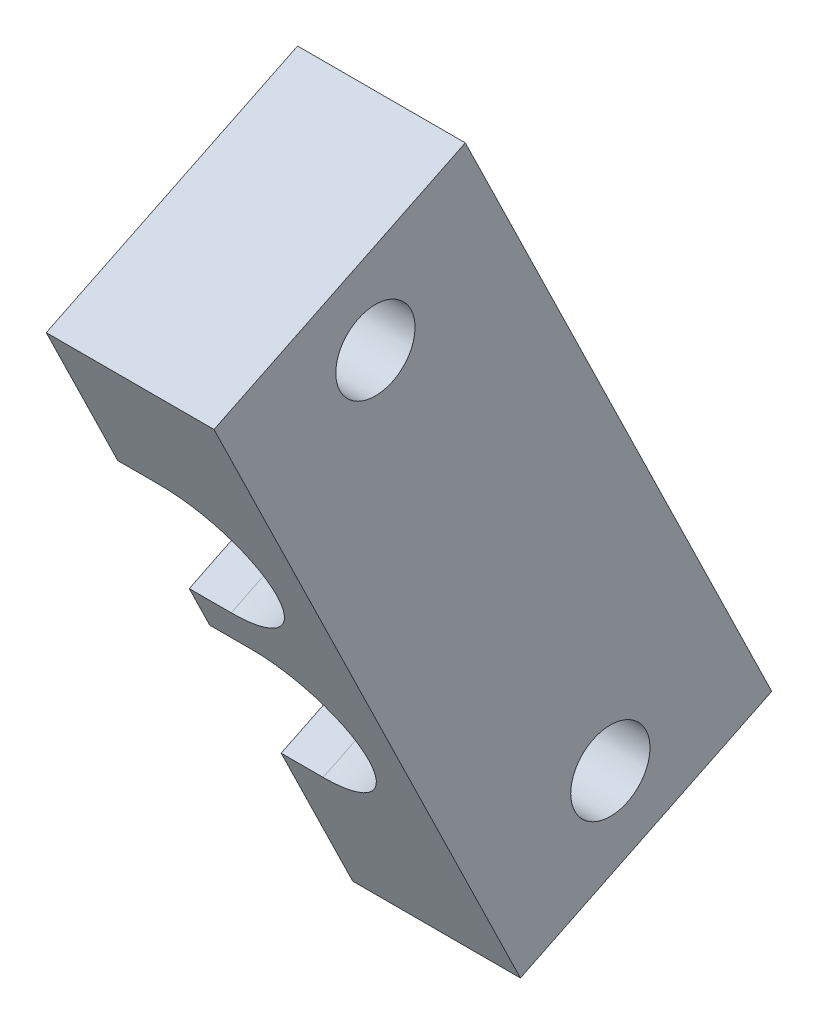
ISO-10303-21;
HEADER;
FILE_DESCRIPTION(('STEP AP214'),'2;1');
FILE_NAME('part.step','',(''),(''),'','','');
FILE_SCHEMA(('AUTOMOTIVE_DESIGN { 1 0 10303 214 1 1 1 1 }'));
ENDSEC;
DATA;
#1=APPLICATION_CONTEXT('core data for automotive mechanical design processes');
#2=APPLICATION_PROTOCOL_DEFINITION('international standard','automotive_design',2000,#1);
#3=PRODUCT_CONTEXT('',#1,'mechanical');
#4=PRODUCT('Part','Part','',(#3));
#5=PRODUCT_RELATED_PRODUCT_CATEGORY('part','',(#4));
#6=PRODUCT_DEFINITION_FORMATION('','',#4);
#7=PRODUCT_DEFINITION_CONTEXT('part definition',#1,'design');
#8=PRODUCT_DEFINITION('design','',#6,#7);
#9=PRODUCT_DEFINITION_SHAPE('','',#8);
#10=(LENGTH_UNIT() NAMED_UNIT(*) SI_UNIT(.MILLI.,.METRE.));
#11=(NAMED_UNIT(*) PLANE_ANGLE_UNIT() SI_UNIT($,.RADIAN.));
#12=(NAMED_UNIT(*) SI_UNIT($,.STERADIAN.) SOLID_ANGLE_UNIT());
#13=UNCERTAINTY_MEASURE_WITH_UNIT(LENGTH_MEASURE(1.E-05),#10,'distance_accuracy_value','');
#14=(GEOMETRIC_REPRESENTATION_CONTEXT(3) GLOBAL_UNCERTAINTY_ASSIGNED_CONTEXT((#13)) GLOBAL_UNIT_ASSIGNED_CONTEXT((#10,
#11,#12)) REPRESENTATION_CONTEXT('',''));
#15=CARTESIAN_POINT('',(0.,0.,0.));
#16=DIRECTION('',(0.,0.,1.));
#17=DIRECTION('',(1.,0.,0.));
#18=AXIS2_PLACEMENT_3D('',#15,#16,#17);
#19=CARTESIAN_POINT('',(-2.46,-10.163821388975,-156.551134403672));
#20=DIRECTION('',(0.,-0.438371146789076,0.898794046299168));
#21=DIRECTION('',(0.,-0.898794046299168,-0.438371146789076));
#22=AXIS2_PLACEMENT_3D('',#19,#20,#21);
#23=PLANE('',#22);
#24=DIRECTION('',(-1.,0.,0.));
#25=VECTOR('',#24,1.);
#26=CARTESIAN_POINT('',(2.94,4.2168833518117,-149.537196055047));
#27=LINE('',#26,#25);
#28=CARTESIAN_POINT('',(11.34,4.21688335181168,-149.537196055047));
#29=VERTEX_POINT('',#28);
#30=CARTESIAN_POINT('',(9.54,4.21688335181169,-149.537196055047));
#31=VERTEX_POINT('',#30);
#32=EDGE_CURVE('E229',#29,#31,#27,.T.);
#33=ORIENTED_EDGE('',*,*,#32,.T.);
#34=DIRECTION('',(0.,-0.898794046299168,-0.438371146789076));
#35=VECTOR('',#34,1.);
#36=CARTESIAN_POINT('',(9.54,-10.163821388975,-156.551134403672));
#37=LINE('',#36,#35);
#38=CARTESIAN_POINT('',(9.54,2.41929525921333,-150.413938348625));
#39=VERTEX_POINT('',#38);
#40=EDGE_CURVE('E142',#31,#39,#37,.T.);
#41=ORIENTED_EDGE('',*,*,#40,.T.);
#42=DIRECTION('',(1.,0.,0.));
#43=VECTOR('',#42,1.);
#44=CARTESIAN_POINT('',(2.94,2.41929525921333,-150.413938348625));
#45=LINE('',#44,#43);
#46=CARTESIAN_POINT('',(11.34,2.41929525921331,-150.413938348625));
#47=VERTEX_POINT('',#46);
#48=EDGE_CURVE('E234',#39,#47,#45,.T.);
#49=ORIENTED_EDGE('',*,*,#48,.T.);
#50=CARTESIAN_POINT('',(11.34,-0.726483902833755,-151.948237362387));
#51=DIRECTION('',(0.,-0.438371146789076,0.898794046299168));
#52=DIRECTION('',(0.,-0.898794046299168,-0.438371146789076));
#53=AXIS2_PLACEMENT_3D('',#50,#51,#52);
#54=CIRCLE('',#53,3.5);
#55=CARTESIAN_POINT('',(11.34,-3.87226306488084,-153.482536376149));
#56=VERTEX_POINT('',#55);
#57=EDGE_CURVE('E161',#47,#56,#54,.F.);
#58=ORIENTED_EDGE('',*,*,#57,.T.);
#59=DIRECTION('',(-1.,0.,0.));
#60=VECTOR('',#59,1.);
#61=CARTESIAN_POINT('',(2.94,-3.87226306488085,-153.482536376149));
#62=LINE('',#61,#60);
#63=CARTESIAN_POINT('',(9.54,-3.87226306488085,-153.482536376149));
#64=VERTEX_POINT('',#63);
#65=EDGE_CURVE('E141',#56,#64,#62,.T.);
#66=ORIENTED_EDGE('',*,*,#65,.T.);
#67=CARTESIAN_POINT('',(9.54,-10.163821388975,-156.551134403672));
#68=VERTEX_POINT('',#67);
#69=EDGE_CURVE('E62',#64,#68,#37,.T.);
#70=ORIENTED_EDGE('',*,*,#69,.T.);
#71=DIRECTION('',(1.,0.,0.));
#72=VECTOR('',#71,1.);
#73=CARTESIAN_POINT('',(-2.46,-10.163821388975,-156.551134403672));
#74=LINE('',#73,#72);
#75=CARTESIAN_POINT('',(16.74,-10.163821388975,-156.551134403672));
#76=VERTEX_POINT('',#75);
#77=EDGE_CURVE('E138',#68,#76,#74,.T.);
#78=ORIENTED_EDGE('',*,*,#77,.T.);
#79=DIRECTION('',(0.,-0.898794046299168,-0.438371146789076));
#80=VECTOR('',#79,1.);
#81=CARTESIAN_POINT('',(16.74,-10.163821388975,-156.551134403672));
#82=LINE('',#81,#80);
#83=CARTESIAN_POINT('',(16.74,16.8,-143.4));
#84=VERTEX_POINT('',#83);
#85=EDGE_CURVE('E207',#84,#76,#82,.T.);
#86=ORIENTED_EDGE('',*,*,#85,.F.);
#87=DIRECTION('',(1.,0.,0.));
#88=VECTOR('',#87,1.);
#89=CARTESIAN_POINT('',(-2.46,16.8,-143.4));
#90=LINE('',#89,#88);
#91=CARTESIAN_POINT('',(9.54,16.8,-143.4));
#92=VERTEX_POINT('',#91);
#93=EDGE_CURVE('E132',#92,#84,#90,.T.);
#94=ORIENTED_EDGE('',*,*,#93,.F.);
#95=CARTESIAN_POINT('',(9.54,10.5084416759058,-146.468598027523));
#96=VERTEX_POINT('',#95);
#97=EDGE_CURVE('E145',#92,#96,#37,.T.);
#98=ORIENTED_EDGE('',*,*,#97,.T.);
#99=DIRECTION('',(1.,0.,0.));
#100=VECTOR('',#99,1.);
#101=CARTESIAN_POINT('',(2.94,10.5084416759058,-146.468598027523));
#102=LINE('',#101,#100);
#103=CARTESIAN_POINT('',(11.34,10.5084416759058,-146.468598027524));
#104=VERTEX_POINT('',#103);
#105=EDGE_CURVE('E214',#96,#104,#102,.T.);
#106=ORIENTED_EDGE('',*,*,#105,.T.);
#107=CARTESIAN_POINT('',(11.34,7.36266251385877,-148.002897041285));
#108=DIRECTION('',(0.,-0.438371146789076,0.898794046299168));
#109=DIRECTION('',(0.,-0.898794046299168,-0.438371146789076));
#110=AXIS2_PLACEMENT_3D('',#107,#108,#109);
#111=CIRCLE('',#110,3.49999999999999);
#112=EDGE_CURVE('E231',#104,#29,#111,.F.);
#113=ORIENTED_EDGE('',*,*,#112,.T.);
#114=EDGE_LOOP('',(#33,#41,#49,#58,#66,#70,#78,#86,#94,#98,#106,#113));
#115=FACE_BOUND('',#114,.T.);
#116=ADVANCED_FACE('F38',(#115),#23,.T.);
#117=CARTESIAN_POINT('',(-2.46,-4.90336762750616,-167.336662959262));
#118=DIRECTION('',(0.,0.438371146789072,-0.89879404629917));
#119=DIRECTION('',(0.,0.89879404629917,0.438371146789072));
#120=AXIS2_PLACEMENT_3D('',#117,#118,#119);
#121=PLANE('',#120);
#122=DIRECTION('',(1.,0.,0.));
#123=VECTOR('',#122,1.);
#124=CARTESIAN_POINT('',(2.94,7.67974902068235,-161.199466904216));
#125=LINE('',#124,#123);
#126=CARTESIAN_POINT('',(9.54,7.67974902068235,-161.199466904216));
#127=VERTEX_POINT('',#126);
#128=CARTESIAN_POINT('',(11.34,7.67974902068235,-161.199466904215));
#129=VERTEX_POINT('',#128);
#130=EDGE_CURVE('E246',#127,#129,#125,.T.);
#131=ORIENTED_EDGE('',*,*,#130,.F.);
#132=DIRECTION('',(0.,0.89879404629917,0.438371146789072));
#133=VECTOR('',#132,1.);
#134=CARTESIAN_POINT('',(9.54,-4.90336762750616,-167.336662959262));
#135=LINE('',#134,#133);
#136=CARTESIAN_POINT('',(9.54,9.47733711328061,-160.322724610637));
#137=VERTEX_POINT('',#136);
#138=EDGE_CURVE('E168',#127,#137,#135,.T.);
#139=ORIENTED_EDGE('',*,*,#138,.T.);
#140=DIRECTION('',(-1.,0.,0.));
#141=VECTOR('',#140,1.);
#142=CARTESIAN_POINT('',(2.94,9.47733711328072,-160.322724610637));
#143=LINE('',#142,#141);
#144=CARTESIAN_POINT('',(11.34,9.47733711328071,-160.322724610637));
#145=VERTEX_POINT('',#144);
#146=EDGE_CURVE('E220',#145,#137,#143,.T.);
#147=ORIENTED_EDGE('',*,*,#146,.F.);
#148=CARTESIAN_POINT('',(11.34,12.6231162753278,-158.788425596876));
#149=DIRECTION('',(0.,0.438371146789075,-0.898794046299168));
#150=DIRECTION('',(0.,0.898794046299168,0.438371146789075));
#151=AXIS2_PLACEMENT_3D('',#148,#149,#150);
#152=CIRCLE('',#151,3.49999999999999);
#153=CARTESIAN_POINT('',(11.34,15.7688954373749,-157.254126583114));
#154=VERTEX_POINT('',#153);
#155=EDGE_CURVE('E224',#154,#145,#152,.T.);
#156=ORIENTED_EDGE('',*,*,#155,.F.);
#157=DIRECTION('',(1.,0.,0.));
#158=VECTOR('',#157,1.);
#159=CARTESIAN_POINT('',(2.94,15.7688954373749,-157.254126583114));
#160=LINE('',#159,#158);
#161=CARTESIAN_POINT('',(9.54,15.7688954373749,-157.254126583114));
#162=VERTEX_POINT('',#161);
#163=EDGE_CURVE('E227',#162,#154,#160,.T.);
#164=ORIENTED_EDGE('',*,*,#163,.F.);
#165=CARTESIAN_POINT('',(9.54,22.0604537614689,-154.18552855559));
#166=VERTEX_POINT('',#165);
#167=EDGE_CURVE('E54',#162,#166,#135,.T.);
#168=ORIENTED_EDGE('',*,*,#167,.T.);
#169=DIRECTION('',(1.,0.,0.));
#170=VECTOR('',#169,1.);
#171=CARTESIAN_POINT('',(-2.46,22.0604537614689,-154.18552855559));
#172=LINE('',#171,#170);
#173=CARTESIAN_POINT('',(16.74,22.0604537614689,-154.18552855559));
#174=VERTEX_POINT('',#173);
#175=EDGE_CURVE('E153',#166,#174,#172,.T.);
#176=ORIENTED_EDGE('',*,*,#175,.T.);
#177=DIRECTION('',(0.,0.89879404629917,0.438371146789072));
#178=VECTOR('',#177,1.);
#179=CARTESIAN_POINT('',(16.74,-4.90336762750616,-167.336662959262));
#180=LINE('',#179,#178);
#181=CARTESIAN_POINT('',(16.74,-4.90336762750616,-167.336662959262));
#182=VERTEX_POINT('',#181);
#183=EDGE_CURVE('E156',#182,#174,#180,.T.);
#184=ORIENTED_EDGE('',*,*,#183,.F.);
#185=DIRECTION('',(1.,0.,0.));
#186=VECTOR('',#185,1.);
#187=CARTESIAN_POINT('',(-2.46,-4.90336762750616,-167.336662959262));
#188=LINE('',#187,#186);
#189=CARTESIAN_POINT('',(9.54,-4.90336762750616,-167.336662959262));
#190=VERTEX_POINT('',#189);
#191=EDGE_CURVE('E150',#190,#182,#188,.T.);
#192=ORIENTED_EDGE('',*,*,#191,.F.);
#193=CARTESIAN_POINT('',(9.54,1.38819069658818,-164.268064931739));
#194=VERTEX_POINT('',#193);
#195=EDGE_CURVE('E128',#190,#194,#135,.T.);
#196=ORIENTED_EDGE('',*,*,#195,.T.);
#197=DIRECTION('',(-1.,0.,0.));
#198=VECTOR('',#197,1.);
#199=CARTESIAN_POINT('',(2.94,1.38819069658818,-164.268064931739));
#200=LINE('',#199,#198);
#201=CARTESIAN_POINT('',(11.34,1.38819069658818,-164.268064931739));
#202=VERTEX_POINT('',#201);
#203=EDGE_CURVE('E240',#202,#194,#200,.T.);
#204=ORIENTED_EDGE('',*,*,#203,.F.);
#205=CARTESIAN_POINT('',(11.34,4.53396985863526,-162.733765917977));
#206=DIRECTION('',(0.,0.438371146789075,-0.898794046299168));
#207=DIRECTION('',(0.,0.898794046299168,0.438371146789075));
#208=AXIS2_PLACEMENT_3D('',#205,#206,#207);
#209=CIRCLE('',#208,3.5);
#210=EDGE_CURVE('E243',#129,#202,#209,.T.);
#211=ORIENTED_EDGE('',*,*,#210,.F.);
#212=EDGE_LOOP('',(#131,#139,#147,#156,#164,#168,#176,#184,#192,#196,#204,#211));
#213=FACE_BOUND('',#212,.T.);
#214=ADVANCED_FACE('F257',(#213),#121,.T.);
#215=CARTESIAN_POINT('',(2.94,-68.2220966862726,-1.01527700287573));
#216=DIRECTION('',(0.,-0.898794046299168,-0.438371146789075));
#217=DIRECTION('',(0.,0.438371146789075,-0.898794046299168));
#218=AXIS2_PLACEMENT_3D('',#215,#216,#217);
#219=PLANE('',#218);
#220=DIRECTION('',(0.,-0.438371146789075,0.898794046299168));
#221=VECTOR('',#220,1.);
#222=CARTESIAN_POINT('',(9.54,-55.5119312890544,-27.0749779439006));
#223=LINE('',#222,#221);
#224=EDGE_CURVE('E143',#137,#31,#223,.T.);
#225=ORIENTED_EDGE('',*,*,#224,.T.);
#226=ORIENTED_EDGE('',*,*,#32,.F.);
#227=DIRECTION('',(0.,0.438371146789075,-0.898794046299168));
#228=VECTOR('',#227,1.);
#229=CARTESIAN_POINT('',(11.34,-68.2220966862726,-1.01527700287573));
#230=LINE('',#229,#228);
#231=EDGE_CURVE('E216',#29,#145,#230,.T.);
#232=ORIENTED_EDGE('',*,*,#231,.T.);
#233=ORIENTED_EDGE('',*,*,#146,.T.);
#234=EDGE_LOOP('',(#225,#226,#232,#233));
#235=FACE_BOUND('',#234,.T.);
#236=ADVANCED_FACE('F262',(#235),#219,.F.);
#237=CARTESIAN_POINT('',(2.94,-61.9305383621784,2.05332102464779));
#238=DIRECTION('',(0.,0.898794046299168,0.438371146789075));
#239=DIRECTION('',(0.,-0.438371146789075,0.898794046299168));
#240=AXIS2_PLACEMENT_3D('',#237,#238,#239);
#241=PLANE('',#240);
#242=DIRECTION('',(0.,0.438371146789075,-0.898794046299168));
#243=VECTOR('',#242,1.);
#244=CARTESIAN_POINT('',(9.54,-49.2203729649603,-24.006379916377));
#245=LINE('',#244,#243);
#246=EDGE_CURVE('E183',#96,#162,#245,.T.);
#247=ORIENTED_EDGE('',*,*,#246,.T.);
#248=ORIENTED_EDGE('',*,*,#163,.T.);
#249=DIRECTION('',(0.,0.438371146789075,-0.898794046299168));
#250=VECTOR('',#249,1.);
#251=CARTESIAN_POINT('',(11.34,-61.9305383621784,2.05332102464776));
#252=LINE('',#251,#250);
#253=EDGE_CURVE('E217',#104,#154,#252,.T.);
#254=ORIENTED_EDGE('',*,*,#253,.F.);
#255=ORIENTED_EDGE('',*,*,#105,.F.);
#256=EDGE_LOOP('',(#247,#248,#254,#255));
#257=FACE_BOUND('',#256,.T.);
#258=ADVANCED_FACE('F271',(#257),#241,.F.);
#259=CARTESIAN_POINT('',(2.94,-76.3112431029652,-4.96061732397742));
#260=DIRECTION('',(0.,-0.898794046299168,-0.438371146789075));
#261=DIRECTION('',(0.,0.438371146789075,-0.898794046299168));
#262=AXIS2_PLACEMENT_3D('',#259,#260,#261);
#263=PLANE('',#262);
#264=DIRECTION('',(0.,-0.438371146789075,0.898794046299168));
#265=VECTOR('',#264,1.);
#266=CARTESIAN_POINT('',(9.54,-63.601077705747,-31.0203182650022));
#267=LINE('',#266,#265);
#268=EDGE_CURVE('E185',#194,#64,#267,.T.);
#269=ORIENTED_EDGE('',*,*,#268,.T.);
#270=ORIENTED_EDGE('',*,*,#65,.F.);
#271=DIRECTION('',(0.,0.438371146789075,-0.898794046299168));
#272=VECTOR('',#271,1.);
#273=CARTESIAN_POINT('',(11.34,-76.3112431029652,-4.96061732397742));
#274=LINE('',#273,#272);
#275=EDGE_CURVE('E236',#56,#202,#274,.T.);
#276=ORIENTED_EDGE('',*,*,#275,.T.);
#277=ORIENTED_EDGE('',*,*,#203,.T.);
#278=EDGE_LOOP('',(#269,#270,#276,#277));
#279=FACE_BOUND('',#278,.T.);
#280=ADVANCED_FACE('F259',(#279),#263,.F.);
#281=CARTESIAN_POINT('',(2.94,-70.019684778871,-1.89201929645391));
#282=DIRECTION('',(0.,0.898794046299168,0.438371146789075));
#283=DIRECTION('',(0.,-0.438371146789075,0.898794046299168));
#284=AXIS2_PLACEMENT_3D('',#281,#282,#283);
#285=PLANE('',#284);
#286=DIRECTION('',(0.,0.438371146789075,-0.898794046299168));
#287=VECTOR('',#286,1.);
#288=CARTESIAN_POINT('',(9.54,-57.3095193816528,-27.9517202374787));
#289=LINE('',#288,#287);
#290=EDGE_CURVE('E187',#39,#127,#289,.T.);
#291=ORIENTED_EDGE('',*,*,#290,.T.);
#292=ORIENTED_EDGE('',*,*,#130,.T.);
#293=DIRECTION('',(0.,0.438371146789075,-0.898794046299168));
#294=VECTOR('',#293,1.);
#295=CARTESIAN_POINT('',(11.34,-70.019684778871,-1.89201929645387));
#296=LINE('',#295,#294);
#297=EDGE_CURVE('E237',#47,#129,#296,.T.);
#298=ORIENTED_EDGE('',*,*,#297,.F.);
#299=ORIENTED_EDGE('',*,*,#48,.F.);
#300=EDGE_LOOP('',(#291,#292,#298,#299));
#301=FACE_BOUND('',#300,.T.);
#302=ADVANCED_FACE('F251',(#301),#285,.F.);
#303=CARTESIAN_POINT('',(-2.46,-4.38781534619346,-160.409599667706));
#304=DIRECTION('',(-1.,0.,0.));
#305=DIRECTION('',(0.,0.,1.));
#306=AXIS2_PLACEMENT_3D('',#303,#304,#305);
#307=CYLINDRICAL_SURFACE('',#306,1.69999999999999);
#308=CARTESIAN_POINT('',(16.74,-4.38781534619346,-160.409599667706));
#309=DIRECTION('',(-1.,0.,0.));
#310=DIRECTION('',(0.,0.,1.));
#311=AXIS2_PLACEMENT_3D('',#308,#309,#310);
#312=CIRCLE('',#311,1.69999999999999);
#313=CARTESIAN_POINT('',(16.74,-4.38781534619346,-158.709599667706));
#314=VERTEX_POINT('',#313);
#315=EDGE_CURVE('E159',#314,#314,#312,.T.);
#316=ORIENTED_EDGE('',*,*,#315,.F.);
#317=EDGE_LOOP('',(#316));
#318=FACE_BOUND('',#317,.T.);
#319=CARTESIAN_POINT('',(9.54,-4.38781534619346,-160.409599667706));
#320=DIRECTION('',(-1.,0.,0.));
#321=DIRECTION('',(0.,0.,1.));
#322=AXIS2_PLACEMENT_3D('',#319,#320,#321);
#323=CIRCLE('',#322,1.69999999999999);
#324=CARTESIAN_POINT('',(9.54,-4.38781534619346,-158.709599667706));
#325=VERTEX_POINT('',#324);
#326=EDGE_CURVE('E190',#325,#325,#323,.T.);
#327=ORIENTED_EDGE('',*,*,#326,.T.);
#328=EDGE_LOOP('',(#327));
#329=FACE_BOUND('',#328,.T.);
#330=ADVANCED_FACE('F299',(#318,#329),#307,.F.);
#331=CARTESIAN_POINT('',(-2.46,16.2844477186874,-150.327063291557));
#332=DIRECTION('',(-1.,0.,0.));
#333=DIRECTION('',(0.,0.,1.));
#334=AXIS2_PLACEMENT_3D('',#331,#332,#333);
#335=CYLINDRICAL_SURFACE('',#334,1.69999999999999);
#336=CARTESIAN_POINT('',(16.74,16.2844477186874,-150.327063291557));
#337=DIRECTION('',(-1.,0.,0.));
#338=DIRECTION('',(0.,0.,1.));
#339=AXIS2_PLACEMENT_3D('',#336,#337,#338);
#340=CIRCLE('',#339,1.69999999999999);
#341=CARTESIAN_POINT('',(16.74,16.2844477186874,-148.627063291557));
#342=VERTEX_POINT('',#341);
#343=EDGE_CURVE('E41',#342,#342,#340,.T.);
#344=ORIENTED_EDGE('',*,*,#343,.F.);
#345=EDGE_LOOP('',(#344));
#346=FACE_BOUND('',#345,.T.);
#347=CARTESIAN_POINT('',(9.54,16.2844477186874,-150.327063291557));
#348=DIRECTION('',(-1.,0.,0.));
#349=DIRECTION('',(0.,0.,1.));
#350=AXIS2_PLACEMENT_3D('',#347,#348,#349);
#351=CIRCLE('',#350,1.69999999999999);
#352=CARTESIAN_POINT('',(9.54,16.2844477186874,-148.627063291557));
#353=VERTEX_POINT('',#352);
#354=EDGE_CURVE('E193',#353,#353,#351,.T.);
#355=ORIENTED_EDGE('',*,*,#354,.T.);
#356=EDGE_LOOP('',(#355));
#357=FACE_BOUND('',#356,.T.);
#358=ADVANCED_FACE('F197',(#346,#357),#335,.F.);
#359=CARTESIAN_POINT('',(-2.46,16.8,-143.4));
#360=DIRECTION('',(0.,0.89879404629917,0.438371146789072));
#361=DIRECTION('',(0.,-0.438371146789072,0.89879404629917));
#362=AXIS2_PLACEMENT_3D('',#359,#360,#361);
#363=PLANE('',#362);
#364=ORIENTED_EDGE('',*,*,#175,.F.);
#365=DIRECTION('',(0.,-0.438371146789072,0.89879404629917));
#366=VECTOR('',#365,1.);
#367=CARTESIAN_POINT('',(9.54,16.8,-143.4));
#368=LINE('',#367,#366);
#369=EDGE_CURVE('E11',#166,#92,#368,.T.);
#370=ORIENTED_EDGE('',*,*,#369,.T.);
#371=ORIENTED_EDGE('',*,*,#93,.T.);
#372=DIRECTION('',(0.,-0.438371146789072,0.89879404629917));
#373=VECTOR('',#372,1.);
#374=CARTESIAN_POINT('',(16.74,16.8,-143.4));
#375=LINE('',#374,#373);
#376=EDGE_CURVE('E151',#174,#84,#375,.T.);
#377=ORIENTED_EDGE('',*,*,#376,.F.);
#378=EDGE_LOOP('',(#364,#370,#371,#377));
#379=FACE_BOUND('',#378,.T.);
#380=ADVANCED_FACE('F205',(#379),#363,.T.);
#381=CARTESIAN_POINT('',(-2.46,-10.163821388975,-156.551134403672));
#382=DIRECTION('',(0.,-0.89879404629917,-0.438371146789071));
#383=DIRECTION('',(0.,0.438371146789071,-0.89879404629917));
#384=AXIS2_PLACEMENT_3D('',#381,#382,#383);
#385=PLANE('',#384);
#386=ORIENTED_EDGE('',*,*,#77,.F.);
#387=DIRECTION('',(0.,0.438371146789071,-0.89879404629917));
#388=VECTOR('',#387,1.);
#389=CARTESIAN_POINT('',(9.54,-10.163821388975,-156.551134403672));
#390=LINE('',#389,#388);
#391=EDGE_CURVE('E46',#68,#190,#390,.T.);
#392=ORIENTED_EDGE('',*,*,#391,.T.);
#393=ORIENTED_EDGE('',*,*,#191,.T.);
#394=DIRECTION('',(0.,0.438371146789071,-0.89879404629917));
#395=VECTOR('',#394,1.);
#396=CARTESIAN_POINT('',(16.74,-10.163821388975,-156.551134403672));
#397=LINE('',#396,#395);
#398=EDGE_CURVE('E148',#76,#182,#397,.T.);
#399=ORIENTED_EDGE('',*,*,#398,.F.);
#400=EDGE_LOOP('',(#386,#392,#393,#399));
#401=FACE_BOUND('',#400,.T.);
#402=ADVANCED_FACE('F146',(#401),#385,.T.);
#403=CARTESIAN_POINT('',(16.74,0.,0.));
#404=DIRECTION('',(-1.,0.,0.));
#405=DIRECTION('',(0.,0.,1.));
#406=AXIS2_PLACEMENT_3D('',#403,#404,#405);
#407=PLANE('',#406);
#408=ORIENTED_EDGE('',*,*,#343,.T.);
#409=EDGE_LOOP('',(#408));
#410=FACE_BOUND('',#409,.T.);
#411=ORIENTED_EDGE('',*,*,#315,.T.);
#412=EDGE_LOOP('',(#411));
#413=FACE_BOUND('',#412,.T.);
#414=ORIENTED_EDGE('',*,*,#85,.T.);
#415=ORIENTED_EDGE('',*,*,#398,.T.);
#416=ORIENTED_EDGE('',*,*,#183,.T.);
#417=ORIENTED_EDGE('',*,*,#376,.T.);
#418=EDGE_LOOP('',(#414,#415,#416,#417));
#419=FACE_BOUND('',#418,.T.);
#420=ADVANCED_FACE('F291',(#410,#413,#419),#407,.F.);
#421=CARTESIAN_POINT('',(11.34,-65.0763175242255,0.519022010886017));
#422=DIRECTION('',(0.,0.438371146789075,-0.898794046299168));
#423=DIRECTION('',(0.,0.898794046299168,0.438371146789075));
#424=AXIS2_PLACEMENT_3D('',#421,#422,#423);
#425=CYLINDRICAL_SURFACE('',#424,3.49999999999999);
#426=ORIENTED_EDGE('',*,*,#253,.T.);
#427=ORIENTED_EDGE('',*,*,#155,.T.);
#428=ORIENTED_EDGE('',*,*,#231,.F.);
#429=ORIENTED_EDGE('',*,*,#112,.F.);
#430=EDGE_LOOP('',(#426,#427,#428,#429));
#431=FACE_BOUND('',#430,.T.);
#432=ADVANCED_FACE('F267',(#431),#425,.F.);
#433=CARTESIAN_POINT('',(11.34,-73.165463940918,-3.42631831021565));
#434=DIRECTION('',(0.,0.438371146789075,-0.898794046299168));
#435=DIRECTION('',(0.,0.898794046299168,0.438371146789075));
#436=AXIS2_PLACEMENT_3D('',#433,#434,#435);
#437=CYLINDRICAL_SURFACE('',#436,3.5);
#438=ORIENTED_EDGE('',*,*,#297,.T.);
#439=ORIENTED_EDGE('',*,*,#210,.T.);
#440=ORIENTED_EDGE('',*,*,#275,.F.);
#441=ORIENTED_EDGE('',*,*,#57,.F.);
#442=EDGE_LOOP('',(#438,#439,#440,#441));
#443=FACE_BOUND('',#442,.T.);
#444=ADVANCED_FACE('F201',(#443),#437,.F.);
#445=CARTESIAN_POINT('',(9.54,0.,0.));
#446=DIRECTION('',(-1.,0.,0.));
#447=DIRECTION('',(0.,0.,1.));
#448=AXIS2_PLACEMENT_3D('',#445,#446,#447);
#449=PLANE('',#448);
#450=ORIENTED_EDGE('',*,*,#354,.F.);
#451=EDGE_LOOP('',(#450));
#452=FACE_BOUND('',#451,.T.);
#453=ORIENTED_EDGE('',*,*,#97,.F.);
#454=ORIENTED_EDGE('',*,*,#369,.F.);
#455=ORIENTED_EDGE('',*,*,#167,.F.);
#456=ORIENTED_EDGE('',*,*,#246,.F.);
#457=EDGE_LOOP('',(#453,#454,#455,#456));
#458=FACE_BOUND('',#457,.T.);
#459=ADVANCED_FACE('F199',(#452,#458),#449,.T.);
#460=ORIENTED_EDGE('',*,*,#326,.F.);
#461=EDGE_LOOP('',(#460));
#462=FACE_BOUND('',#461,.T.);
#463=ORIENTED_EDGE('',*,*,#195,.F.);
#464=ORIENTED_EDGE('',*,*,#391,.F.);
#465=ORIENTED_EDGE('',*,*,#69,.F.);
#466=ORIENTED_EDGE('',*,*,#268,.F.);
#467=EDGE_LOOP('',(#463,#464,#465,#466));
#468=FACE_BOUND('',#467,.T.);
#469=ADVANCED_FACE('F126',(#462,#468),#449,.T.);
#470=ORIENTED_EDGE('',*,*,#138,.F.);
#471=ORIENTED_EDGE('',*,*,#290,.F.);
#472=ORIENTED_EDGE('',*,*,#40,.F.);
#473=ORIENTED_EDGE('',*,*,#224,.F.);
#474=EDGE_LOOP('',(#470,#471,#472,#473));
#475=FACE_BOUND('',#474,.T.);
#476=ADVANCED_FACE('F203',(#475),#449,.T.);
#477=CLOSED_SHELL('',(#116,#214,#236,#258,#280,#302,#330,#358,#380,#402,#420,#432,#444,#459,
#469,#476));
#478=MANIFOLD_SOLID_BREP('B2',#477);
#479=ADVANCED_BREP_SHAPE_REPRESENTATION('',(#18,#478),#14);
#480=SHAPE_DEFINITION_REPRESENTATION(#9,#479);
ENDSEC;
END-ISO-10303-21;
